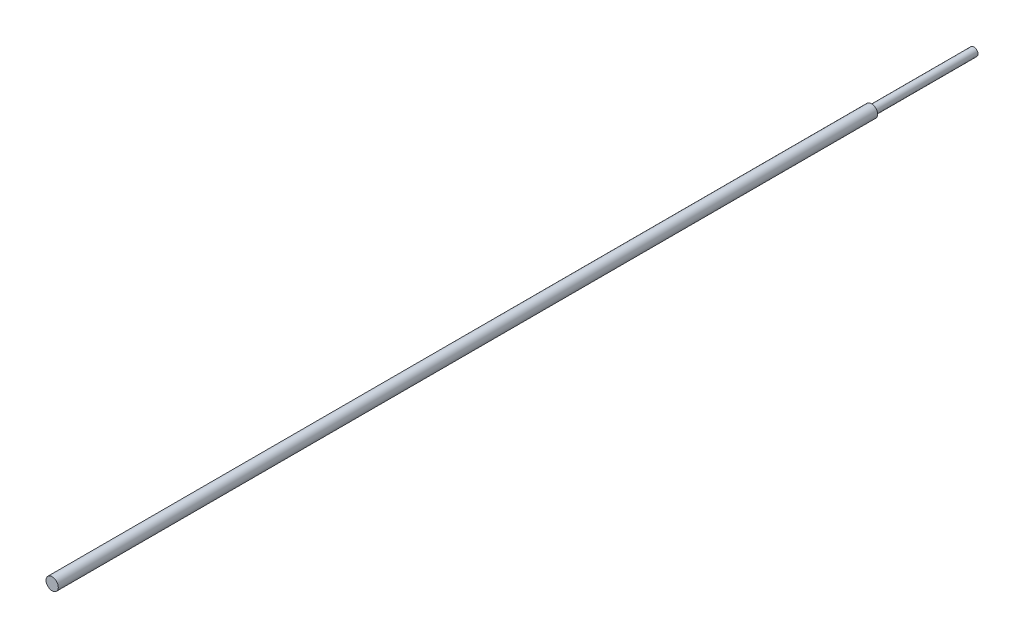
ISO-10303-21;
HEADER;
FILE_DESCRIPTION(('STEP AP214'),'2;1');
FILE_NAME('part.step','',(''),(''),'','','');
FILE_SCHEMA(('AUTOMOTIVE_DESIGN { 1 0 10303 214 1 1 1 1 }'));
ENDSEC;
DATA;
#1=APPLICATION_CONTEXT('core data for automotive mechanical design processes');
#2=APPLICATION_PROTOCOL_DEFINITION('international standard','automotive_design',2000,#1);
#3=PRODUCT_CONTEXT('',#1,'mechanical');
#4=PRODUCT('Part','Part','',(#3));
#5=PRODUCT_RELATED_PRODUCT_CATEGORY('part','',(#4));
#6=PRODUCT_DEFINITION_FORMATION('','',#4);
#7=PRODUCT_DEFINITION_CONTEXT('part definition',#1,'design');
#8=PRODUCT_DEFINITION('design','',#6,#7);
#9=PRODUCT_DEFINITION_SHAPE('','',#8);
#10=(LENGTH_UNIT() NAMED_UNIT(*) SI_UNIT(.MILLI.,.METRE.));
#11=(NAMED_UNIT(*) PLANE_ANGLE_UNIT() SI_UNIT($,.RADIAN.));
#12=(NAMED_UNIT(*) SI_UNIT($,.STERADIAN.) SOLID_ANGLE_UNIT());
#13=UNCERTAINTY_MEASURE_WITH_UNIT(LENGTH_MEASURE(1.E-05),#10,'distance_accuracy_value','');
#14=(GEOMETRIC_REPRESENTATION_CONTEXT(3) GLOBAL_UNCERTAINTY_ASSIGNED_CONTEXT((#13)) GLOBAL_UNIT_ASSIGNED_CONTEXT((#10,
#11,#12)) REPRESENTATION_CONTEXT('',''));
#15=CARTESIAN_POINT('',(0.,0.,0.));
#16=DIRECTION('',(0.,0.,1.));
#17=DIRECTION('',(1.,0.,0.));
#18=AXIS2_PLACEMENT_3D('',#15,#16,#17);
#19=CARTESIAN_POINT('',(0.,0.,0.));
#20=DIRECTION('',(0.,0.,1.));
#21=DIRECTION('',(1.,0.,0.));
#22=AXIS2_PLACEMENT_3D('',#19,#20,#21);
#23=PLANE('',#22);
#24=CARTESIAN_POINT('',(0.,0.,0.));
#25=DIRECTION('',(0.,0.,1.));
#26=DIRECTION('',(1.,0.,0.));
#27=AXIS2_PLACEMENT_3D('',#24,#25,#26);
#28=CIRCLE('',#27,0.6);
#29=CARTESIAN_POINT('',(0.6,0.,0.));
#30=VERTEX_POINT('',#29);
#31=EDGE_CURVE('E37',#30,#30,#28,.T.);
#32=ORIENTED_EDGE('',*,*,#31,.F.);
#33=EDGE_LOOP('',(#32));
#34=FACE_BOUND('',#33,.T.);
#35=CARTESIAN_POINT('',(0.,0.,0.));
#36=DIRECTION('',(0.,0.,1.));
#37=DIRECTION('',(1.,0.,0.));
#38=AXIS2_PLACEMENT_3D('',#35,#36,#37);
#39=CIRCLE('',#38,0.4);
#40=CARTESIAN_POINT('',(0.4,0.,0.));
#41=VERTEX_POINT('',#40);
#42=EDGE_CURVE('E10',#41,#41,#39,.F.);
#43=ORIENTED_EDGE('',*,*,#42,.F.);
#44=EDGE_LOOP('',(#43));
#45=FACE_BOUND('',#44,.T.);
#46=ADVANCED_FACE('F26',(#34,#45),#23,.F.);
#47=CARTESIAN_POINT('',(0.,0.,80.));
#48=DIRECTION('',(0.,0.,-1.));
#49=DIRECTION('',(-1.,0.,0.));
#50=AXIS2_PLACEMENT_3D('',#47,#48,#49);
#51=CYLINDRICAL_SURFACE('',#50,0.6);
#52=CARTESIAN_POINT('',(0.,0.,80.));
#53=DIRECTION('',(0.,0.,1.));
#54=DIRECTION('',(1.,0.,0.));
#55=AXIS2_PLACEMENT_3D('',#52,#53,#54);
#56=CIRCLE('',#55,0.6);
#57=CARTESIAN_POINT('',(0.6,0.,80.));
#58=VERTEX_POINT('',#57);
#59=EDGE_CURVE('E33',#58,#58,#56,.T.);
#60=ORIENTED_EDGE('',*,*,#59,.F.);
#61=EDGE_LOOP('',(#60));
#62=FACE_BOUND('',#61,.T.);
#63=ORIENTED_EDGE('',*,*,#31,.T.);
#64=EDGE_LOOP('',(#63));
#65=FACE_BOUND('',#64,.T.);
#66=ADVANCED_FACE('F28',(#62,#65),#51,.T.);
#67=CARTESIAN_POINT('',(0.,0.,80.));
#68=DIRECTION('',(0.,0.,1.));
#69=DIRECTION('',(1.,0.,0.));
#70=AXIS2_PLACEMENT_3D('',#67,#68,#69);
#71=PLANE('',#70);
#72=ORIENTED_EDGE('',*,*,#59,.T.);
#73=EDGE_LOOP('',(#72));
#74=FACE_BOUND('',#73,.T.);
#75=ADVANCED_FACE('F51',(#74),#71,.T.);
#76=CARTESIAN_POINT('',(0.,0.,-10.));
#77=DIRECTION('',(0.,0.,1.));
#78=DIRECTION('',(1.,0.,0.));
#79=AXIS2_PLACEMENT_3D('',#76,#77,#78);
#80=CYLINDRICAL_SURFACE('',#79,0.4);
#81=CARTESIAN_POINT('',(0.,0.,-10.));
#82=DIRECTION('',(0.,0.,-1.));
#83=DIRECTION('',(-1.,0.,0.));
#84=AXIS2_PLACEMENT_3D('',#81,#82,#83);
#85=CIRCLE('',#84,0.4);
#86=CARTESIAN_POINT('',(-0.4,0.,-10.));
#87=VERTEX_POINT('',#86);
#88=EDGE_CURVE('E41',#87,#87,#85,.T.);
#89=ORIENTED_EDGE('',*,*,#88,.F.);
#90=EDGE_LOOP('',(#89));
#91=FACE_BOUND('',#90,.T.);
#92=ORIENTED_EDGE('',*,*,#42,.T.);
#93=EDGE_LOOP('',(#92));
#94=FACE_BOUND('',#93,.T.);
#95=ADVANCED_FACE('F49',(#91,#94),#80,.T.);
#96=CARTESIAN_POINT('',(0.,0.,-10.));
#97=DIRECTION('',(0.,0.,-1.));
#98=DIRECTION('',(-1.,0.,0.));
#99=AXIS2_PLACEMENT_3D('',#96,#97,#98);
#100=PLANE('',#99);
#101=ORIENTED_EDGE('',*,*,#88,.T.);
#102=EDGE_LOOP('',(#101));
#103=FACE_BOUND('',#102,.T.);
#104=ADVANCED_FACE('F47',(#103),#100,.T.);
#105=CLOSED_SHELL('',(#46,#66,#75,#95,#104));
#106=MANIFOLD_SOLID_BREP('B2',#105);
#107=ADVANCED_BREP_SHAPE_REPRESENTATION('',(#18,#106),#14);
#108=SHAPE_DEFINITION_REPRESENTATION(#9,#107);
ENDSEC;
END-ISO-10303-21;
